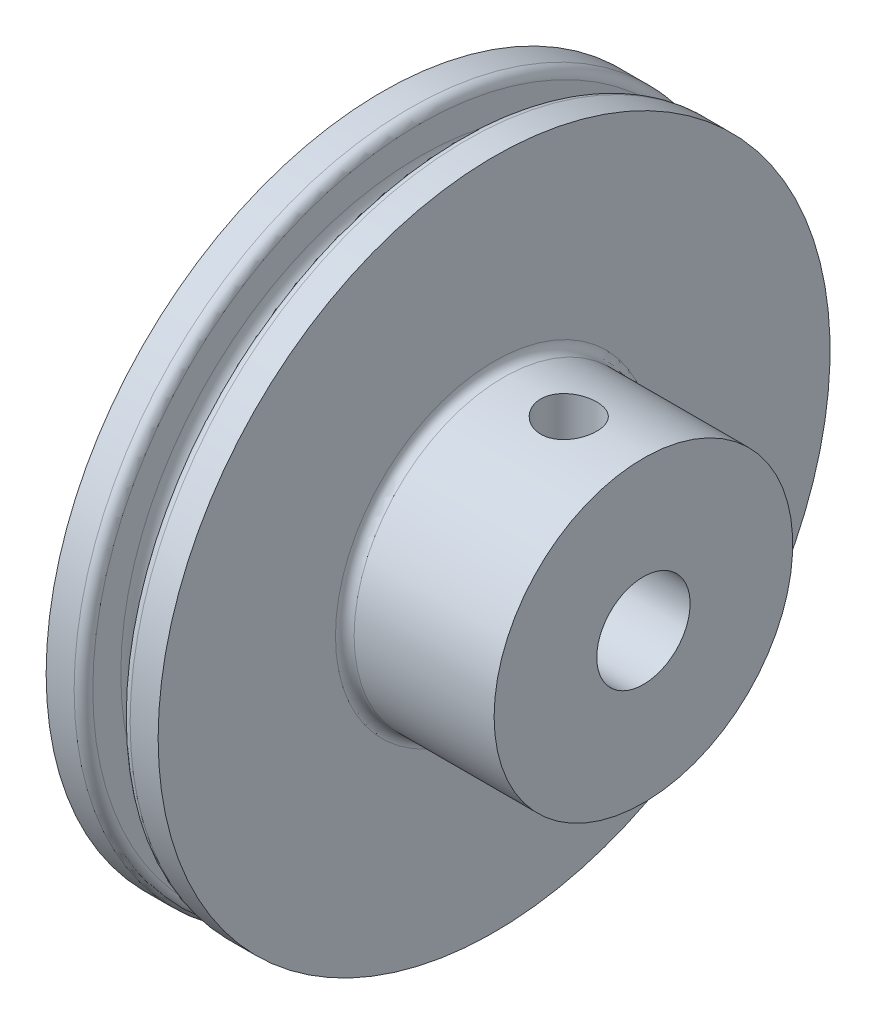
ISO-10303-21;
HEADER;
FILE_DESCRIPTION(('STEP AP214'),'2;1');
FILE_NAME('part.step','',(''),(''),'','','');
FILE_SCHEMA(('AUTOMOTIVE_DESIGN { 1 0 10303 214 1 1 1 1 }'));
ENDSEC;
DATA;
#1=APPLICATION_CONTEXT('core data for automotive mechanical design processes');
#2=APPLICATION_PROTOCOL_DEFINITION('international standard','automotive_design',2000,#1);
#3=PRODUCT_CONTEXT('',#1,'mechanical');
#4=PRODUCT('Part','Part','',(#3));
#5=PRODUCT_RELATED_PRODUCT_CATEGORY('part','',(#4));
#6=PRODUCT_DEFINITION_FORMATION('','',#4);
#7=PRODUCT_DEFINITION_CONTEXT('part definition',#1,'design');
#8=PRODUCT_DEFINITION('design','',#6,#7);
#9=PRODUCT_DEFINITION_SHAPE('','',#8);
#10=(LENGTH_UNIT() NAMED_UNIT(*) SI_UNIT(.MILLI.,.METRE.));
#11=(NAMED_UNIT(*) PLANE_ANGLE_UNIT() SI_UNIT($,.RADIAN.));
#12=(NAMED_UNIT(*) SI_UNIT($,.STERADIAN.) SOLID_ANGLE_UNIT());
#13=UNCERTAINTY_MEASURE_WITH_UNIT(LENGTH_MEASURE(1.E-05),#10,'distance_accuracy_value','');
#14=(GEOMETRIC_REPRESENTATION_CONTEXT(3) GLOBAL_UNCERTAINTY_ASSIGNED_CONTEXT((#13)) GLOBAL_UNIT_ASSIGNED_CONTEXT((#10,
#11,#12)) REPRESENTATION_CONTEXT('',''));
#15=CARTESIAN_POINT('',(0.,0.,0.));
#16=DIRECTION('',(0.,0.,1.));
#17=DIRECTION('',(1.,0.,0.));
#18=AXIS2_PLACEMENT_3D('',#15,#16,#17);
#19=CARTESIAN_POINT('',(-11.5426807899439,-7.97709760738326,0.));
#20=DIRECTION('',(-1.,0.,0.));
#21=DIRECTION('',(0.,0.,1.));
#22=AXIS2_PLACEMENT_3D('',#19,#20,#21);
#23=CYLINDRICAL_SURFACE('',#22,8.);
#24=CARTESIAN_POINT('',(2.45731921005608,-7.97709760738326,0.));
#25=DIRECTION('',(-1.,0.,0.));
#26=DIRECTION('',(0.,0.,1.));
#27=AXIS2_PLACEMENT_3D('',#24,#25,#26);
#28=CIRCLE('',#27,8.);
#29=CARTESIAN_POINT('',(2.45731921005608,-7.97709760738326,8.));
#30=VERTEX_POINT('',#29);
#31=EDGE_CURVE('E72',#30,#30,#28,.T.);
#32=ORIENTED_EDGE('',*,*,#31,.T.);
#33=EDGE_LOOP('',(#32));
#34=FACE_BOUND('',#33,.T.);
#35=CARTESIAN_POINT('',(-5.04268078994391,-7.97709760738326,0.));
#36=DIRECTION('',(-1.,0.,0.));
#37=DIRECTION('',(0.,0.,1.));
#38=AXIS2_PLACEMENT_3D('',#35,#36,#37);
#39=CIRCLE('',#38,8.);
#40=CARTESIAN_POINT('',(-5.04268078994391,-7.97709760738326,8.));
#41=VERTEX_POINT('',#40);
#42=EDGE_CURVE('E69',#41,#41,#39,.T.);
#43=ORIENTED_EDGE('',*,*,#42,.F.);
#44=EDGE_LOOP('',(#43));
#45=FACE_BOUND('',#44,.T.);
#46=CARTESIAN_POINT('',(-1.54268078994392,-0.1189807846324,-1.5));
#47=CARTESIAN_POINT('',(-1.62613799795566,-0.118979169448321,-1.49999679883246));
#48=CARTESIAN_POINT('',(-1.70963673816231,-0.117636809780593,-1.49301126348936));
#49=CARTESIAN_POINT('',(-1.87427975152583,-0.112419097239615,-1.46527253251805));
#50=CARTESIAN_POINT('',(-1.9554219663714,-0.108541595651204,-1.44450765768477));
#51=CARTESIAN_POINT('',(-2.11294586131479,-0.0987078427344111,-1.38987035617788));
#52=CARTESIAN_POINT('',(-2.18933189925121,-0.0927535283232876,-1.35601013954374));
#53=CARTESIAN_POINT('',(-2.33533434923073,-0.0794393441736656,-1.27617565760366));
#54=CARTESIAN_POINT('',(-2.40495128894722,-0.0720795841270393,-1.23020233759193));
#55=CARTESIAN_POINT('',(-2.53631098914305,-0.0566814589938103,-1.12683678942622));
#56=CARTESIAN_POINT('',(-2.59795727341565,-0.0486364411264648,-1.06932292933092));
#57=CARTESIAN_POINT('',(-2.71078517954348,-0.0328330307429168,-0.944771778803551));
#58=CARTESIAN_POINT('',(-2.76196611436871,-0.025074657071728,-0.877733863624944));
#59=CARTESIAN_POINT('',(-2.85278016654443,-0.010647429099206,-0.735403894570162));
#60=CARTESIAN_POINT('',(-2.89232232346334,-0.0039873268596266,-0.660052840033865));
#61=CARTESIAN_POINT('',(-2.95815033221745,0.0074184789460498,-0.503631283250762));
#62=CARTESIAN_POINT('',(-2.98443727393414,0.012164339900085,-0.422561251859505));
#63=CARTESIAN_POINT('',(-3.02271033855505,0.0191599438545286,-0.258002746187416));
#64=CARTESIAN_POINT('',(-3.0348590958666,0.0214380523800125,-0.174553323244857));
#65=CARTESIAN_POINT('',(-3.04501767764432,0.0233392387726849,-0.00677167603538295));
#66=CARTESIAN_POINT('',(-3.04302870608297,0.0229625427237117,0.0775604724476703));
#67=CARTESIAN_POINT('',(-3.02509301879677,0.019618730249157,0.243598357899397));
#68=CARTESIAN_POINT('',(-3.00932142051391,0.0166841150888811,0.325323760451469));
#69=CARTESIAN_POINT('',(-2.96454514054868,0.0085906559523551,0.484947165715476));
#70=CARTESIAN_POINT('',(-2.93553997659811,0.00343173091639956,0.562845028826541));
#71=CARTESIAN_POINT('',(-2.86495305888562,-0.00858500440986463,0.713110065751521));
#72=CARTESIAN_POINT('',(-2.82330130203142,-0.0154522314750013,0.785443571838533));
#73=CARTESIAN_POINT('',(-2.72865512086676,-0.030126131954757,0.922159977214638));
#74=CARTESIAN_POINT('',(-2.67565954305634,-0.0379329008716158,0.986542066910785));
#75=CARTESIAN_POINT('',(-2.55886508696039,-0.0537624705775899,1.10656561896904));
#76=CARTESIAN_POINT('',(-2.49491300604184,-0.0617867483670413,1.16205790757041));
#77=CARTESIAN_POINT('',(-2.35853125866529,-0.07703251813705,1.2615517185126));
#78=CARTESIAN_POINT('',(-2.28610146817928,-0.0842539983697489,1.30555307271182));
#79=CARTESIAN_POINT('',(-2.13462251924126,-0.0970786743120412,1.38085852224478));
#80=CARTESIAN_POINT('',(-2.05556233275327,-0.102679102080645,1.41214093645421));
#81=CARTESIAN_POINT('',(-1.89317960582072,-0.111585183416364,1.46093656975056));
#82=CARTESIAN_POINT('',(-1.80985754947913,-0.114891096997061,1.47845134901108));
#83=CARTESIAN_POINT('',(-1.64266146108804,-0.118782404373203,1.49899672649739));
#84=CARTESIAN_POINT('',(-1.5588146743784,-0.119408049221891,1.50224164285859));
#85=CARTESIAN_POINT('',(-1.39177733485677,-0.117975693174853,1.49472968881724));
#86=CARTESIAN_POINT('',(-1.30858674979583,-0.115917824997143,1.48397351086433));
#87=CARTESIAN_POINT('',(-1.14592788688953,-0.109387806751202,1.44894868195883));
#88=CARTESIAN_POINT('',(-1.06643453731902,-0.104935740474469,1.4247923858399));
#89=CARTESIAN_POINT('',(-0.91262360021376,-0.0941362658170685,1.3637722437906));
#90=CARTESIAN_POINT('',(-0.838306394628586,-0.0877887177504444,1.32690746128795));
#91=CARTESIAN_POINT('',(-0.696013170900749,-0.0738218287464044,1.2410235311966));
#92=CARTESIAN_POINT('',(-0.628120252077844,-0.0661886531301031,1.19186899639621));
#93=CARTESIAN_POINT('',(-0.501468749729585,-0.0505494937022523,1.08298344344247));
#94=CARTESIAN_POINT('',(-0.442710988388144,-0.0425434764183196,1.02325147433084));
#95=CARTESIAN_POINT('',(-0.335197026409792,-0.0269313673237975,0.893949417870385));
#96=CARTESIAN_POINT('',(-0.286584963337952,-0.0193320490502059,0.82425853409589));
#97=CARTESIAN_POINT('',(-0.201759583766254,-0.0055035592797496,0.677574523040139));
#98=CARTESIAN_POINT('',(-0.165545789918912,0.000725664963992805,0.600581677038528));
#99=CARTESIAN_POINT('',(-0.106760692079837,0.0110829725752218,0.441877541578683));
#100=CARTESIAN_POINT('',(-0.0841186023825082,0.0152219399181671,0.360193213078987));
#101=CARTESIAN_POINT('',(-0.052893741654032,0.020978813454195,0.19409622738157));
#102=CARTESIAN_POINT('',(-0.0443094912812086,0.0225969849160743,0.10968385821585));
#103=CARTESIAN_POINT('',(-0.0414954884254764,0.0231246677711521,-0.05809076025051));
#104=CARTESIAN_POINT('',(-0.0470480368143909,0.022075258867063,-0.141449307066269));
#105=CARTESIAN_POINT('',(-0.0718732177123534,0.0174710587337709,-0.3060233692792));
#106=CARTESIAN_POINT('',(-0.0911457186881286,0.0139162915234572,-0.38723890521369));
#107=CARTESIAN_POINT('',(-0.142771997327635,0.00470077239719345,-0.545106475595485));
#108=CARTESIAN_POINT('',(-0.175102602824925,-0.00095624756749898,-0.621766319318224));
#109=CARTESIAN_POINT('',(-0.251901243599101,-0.0137638866955471,-0.768605631316695));
#110=CARTESIAN_POINT('',(-0.296370092050572,-0.0209146059184257,-0.838784665003271));
#111=CARTESIAN_POINT('',(-0.39693224438624,-0.0360498087838449,-0.971755027780007));
#112=CARTESIAN_POINT('',(-0.453182823805624,-0.044044761470537,-1.03442623539053));
#113=CARTESIAN_POINT('',(-0.575385352436625,-0.0599012719949244,-1.14951536065485));
#114=CARTESIAN_POINT('',(-0.641339580317638,-0.0677627980156094,-1.2019308632478));
#115=CARTESIAN_POINT('',(-0.781807244647263,-0.0825418331239993,-1.29547633945385));
#116=CARTESIAN_POINT('',(-0.856394229611557,-0.0894499345759686,-1.33649740531872));
#117=CARTESIAN_POINT('',(-1.01150657992366,-0.101426760882926,-1.40536132423417));
#118=CARTESIAN_POINT('',(-1.0920262565333,-0.106497220892092,-1.43321661638912));
#119=CARTESIAN_POINT('',(-1.23443307800983,-0.113167444462008,-1.46929726596175));
#120=CARTESIAN_POINT('',(-1.29548651370586,-0.115334500203935,-1.4807910573985));
#121=CARTESIAN_POINT('',(-1.41857925836423,-0.118241751428211,-1.49614351076215));
#122=CARTESIAN_POINT('',(-1.48061854044424,-0.118981985750431,-1.50000238052127));
#123=CARTESIAN_POINT('',(-1.54268078994392,-0.1189807846324,-1.5));
#124=B_SPLINE_CURVE_WITH_KNOTS('',3,(#46,#47,#48,#49,#50,#51,#52,#53,#54,#55,#56,#57,#58,#59,
#60,#61,#62,#63,#64,#65,#66,#67,#68,#69,#70,#71,#72,#73,#74,#75,#76,#77,#78,#79,#80,#81,#82,#83,
#84,#85,#86,#87,#88,#89,#90,#91,#92,#93,#94,#95,#96,#97,#98,#99,#100,#101,#102,#103,#104,#105,
#106,#107,#108,#109,#110,#111,#112,#113,#114,#115,#116,#117,#118,#119,#120,#121,#122,#123),
.UNSPECIFIED.,.T.,.F.,(4,2,2,2,2,2,2,2,2,2,2,2,2,2,2,2,2,2,2,2,2,2,2,2,2,2,2,2,2,2,2,2,2,2,2,2,
2,2,4),(0.,0.250144505793186,0.500501302380393,0.750625227978432,1.00072963993908,
1.25362335698691,1.50653367069315,1.76137104348047,2.0161874593964,2.26804275460261,
2.51987660200648,2.76855650598725,3.01724547328425,3.26733691984219,3.51745380911785,
3.77140614764064,4.025362201924,4.27974936118266,4.53410768866488,4.78463248587075,
5.03514489338718,5.28358792315368,5.53204926624317,5.78337862654143,6.03473059394677,
6.28944125495871,6.54414210821705,6.79750269418683,7.0508366166733,7.30029300570138,
7.54974700322167,7.79876026530358,8.0477902135711,8.30038464008745,8.55303847730765,
8.80803001818118,9.06278015749119,9.24880307527214,9.43482092920425),.UNSPECIFIED.);
#125=CARTESIAN_POINT('',(-1.54268078994392,-0.1189807846324,-1.5));
#126=VERTEX_POINT('',#125);
#127=EDGE_CURVE('E81',#126,#126,#124,.T.);
#128=ORIENTED_EDGE('',*,*,#127,.F.);
#129=EDGE_LOOP('',(#128));
#130=FACE_BOUND('',#129,.T.);
#131=ADVANCED_FACE('F30',(#34,#45,#130),#23,.T.);
#132=CARTESIAN_POINT('',(-11.5426807899439,-7.97709760738326,0.));
#133=DIRECTION('',(-1.,0.,0.));
#134=DIRECTION('',(0.,0.,1.));
#135=AXIS2_PLACEMENT_3D('',#132,#133,#134);
#136=CYLINDRICAL_SURFACE('',#135,2.5);
#137=CARTESIAN_POINT('',(-11.5426807899439,-7.97709760738326,0.));
#138=DIRECTION('',(-1.,0.,0.));
#139=DIRECTION('',(0.,0.,1.));
#140=AXIS2_PLACEMENT_3D('',#137,#138,#139);
#141=CIRCLE('',#140,2.5);
#142=CARTESIAN_POINT('',(-11.5426807899439,-7.97709760738326,2.5));
#143=VERTEX_POINT('',#142);
#144=EDGE_CURVE('E78',#143,#143,#141,.T.);
#145=ORIENTED_EDGE('',*,*,#144,.T.);
#146=EDGE_LOOP('',(#145));
#147=FACE_BOUND('',#146,.T.);
#148=CARTESIAN_POINT('',(2.45731921005608,-7.97709760738326,0.));
#149=DIRECTION('',(-1.,0.,0.));
#150=DIRECTION('',(0.,0.,1.));
#151=AXIS2_PLACEMENT_3D('',#148,#149,#150);
#152=CIRCLE('',#151,2.5);
#153=CARTESIAN_POINT('',(2.45731921005608,-7.97709760738326,2.5));
#154=VERTEX_POINT('',#153);
#155=EDGE_CURVE('E75',#154,#154,#152,.T.);
#156=ORIENTED_EDGE('',*,*,#155,.F.);
#157=EDGE_LOOP('',(#156));
#158=FACE_BOUND('',#157,.T.);
#159=CARTESIAN_POINT('',(-1.54268078994392,-5.97709760738325,-1.5));
#160=CARTESIAN_POINT('',(-1.46720181465428,-5.97710344095814,-1.50000404108592));
#161=CARTESIAN_POINT('',(-1.39174235586412,-5.97276126834844,-1.49426852824013));
#162=CARTESIAN_POINT('',(-1.2433568859817,-5.95617170124443,-1.47174965152787));
#163=CARTESIAN_POINT('',(-1.17043360255882,-5.94391605695228,-1.45495475788936));
#164=CARTESIAN_POINT('',(-1.02959714826664,-5.91347421703596,-1.41143486335795));
#165=CARTESIAN_POINT('',(-0.961651951908651,-5.89533094555206,-1.3847815450315));
#166=CARTESIAN_POINT('',(-0.831243336575999,-5.8552385574249,-1.32252909283019));
#167=CARTESIAN_POINT('',(-0.76878156024878,-5.8332883061591,-1.28692729054693));
#168=CARTESIAN_POINT('',(-0.642731773279836,-5.78481166150783,-1.20271292747644));
#169=CARTESIAN_POINT('',(-0.579939832819976,-5.75805389700663,-1.15304179435289));
#170=CARTESIAN_POINT('',(-0.462916027202164,-5.70483531307265,-1.04426801309985));
#171=CARTESIAN_POINT('',(-0.408690638273116,-5.67837473221223,-0.985158296729613));
#172=CARTESIAN_POINT('',(-0.304546980234223,-5.62534192879592,-0.851442367411701));
#173=CARTESIAN_POINT('',(-0.255726326274167,-5.59906627160508,-0.775851995162548));
#174=CARTESIAN_POINT('',(-0.171871067499486,-5.55265973755146,-0.615654228271658));
#175=CARTESIAN_POINT('',(-0.136823815821204,-5.53252322749591,-0.531055196626331));
#176=CARTESIAN_POINT('',(-0.0850848671312704,-5.50238772937885,-0.363771406742667));
#177=CARTESIAN_POINT('',(-0.0669604289766213,-5.49160456799156,-0.281674698130916));
#178=CARTESIAN_POINT('',(-0.0447379870807973,-5.4783482146078,-0.114970509382709));
#179=CARTESIAN_POINT('',(-0.0406268119438634,-5.47586721925018,-0.0303654624001541));
#180=CARTESIAN_POINT('',(-0.0462945372863787,-5.47926388026787,0.127637283737309));
#181=CARTESIAN_POINT('',(-0.0544143161132306,-5.48414323224599,0.201123832865634));
#182=CARTESIAN_POINT('',(-0.0811605855920249,-5.50001763184468,0.345464269151767));
#183=CARTESIAN_POINT('',(-0.0997878538510733,-5.51101313209017,0.416317961051201));
#184=CARTESIAN_POINT('',(-0.146846352647696,-5.53824853536606,0.554056780469079));
#185=CARTESIAN_POINT('',(-0.175333851082915,-5.55451850287502,0.620916491037617));
#186=CARTESIAN_POINT('',(-0.24106540616946,-5.59100123099577,0.74898866011561));
#187=CARTESIAN_POINT('',(-0.278311737002929,-5.61121501536514,0.810199646208011));
#188=CARTESIAN_POINT('',(-0.365519882748369,-5.65671834761963,0.933074267143199));
#189=CARTESIAN_POINT('',(-0.416469101679654,-5.68232577786176,0.993918663198193));
#190=CARTESIAN_POINT('',(-0.527084907804094,-5.73454206492724,1.10671465909275));
#191=CARTESIAN_POINT('',(-0.586763293418424,-5.7611522403495,1.1586540130834));
#192=CARTESIAN_POINT('',(-0.721334196107472,-5.8159868561438,1.25824837767417));
#193=CARTESIAN_POINT('',(-0.79718836648338,-5.84404099353201,1.30470933188632));
#194=CARTESIAN_POINT('',(-0.957387021580526,-5.89458881181058,1.38397217194232));
#195=CARTESIAN_POINT('',(-1.04171550606956,-5.91709270439505,1.41679921962189));
#196=CARTESIAN_POINT('',(-1.19507442183927,-5.94813895541594,1.46077497064842));
#197=CARTESIAN_POINT('',(-1.26272142224056,-5.9587587212001,1.47527903312665));
#198=CARTESIAN_POINT('',(-1.4000544002434,-5.97317609960767,1.49480872755284));
#199=CARTESIAN_POINT('',(-1.46973791042848,-5.97698164623209,1.49984538302907));
#200=CARTESIAN_POINT('',(-1.60923247237962,-5.97720846417003,1.50014781114183));
#201=CARTESIAN_POINT('',(-1.67904356715913,-5.97361950514341,1.49540004697659));
#202=CARTESIAN_POINT('',(-1.81666813369248,-5.95958239949673,1.47640290574941));
#203=CARTESIAN_POINT('',(-1.88447998218417,-5.94912883125113,1.46214601830139));
#204=CARTESIAN_POINT('',(-2.0163953694237,-5.92277992405225,1.42488312618657));
#205=CARTESIAN_POINT('',(-2.08050342647615,-5.90689138645514,1.40188805257362));
#206=CARTESIAN_POINT('',(-2.2041585056741,-5.87138221320739,1.34796261057072));
#207=CARTESIAN_POINT('',(-2.26370379630992,-5.85176017048327,1.31702924888212));
#208=CARTESIAN_POINT('',(-2.38792087245616,-5.80672941560589,1.24167439558512));
#209=CARTESIAN_POINT('',(-2.45158162504049,-5.78091521340957,1.19582663060303));
#210=CARTESIAN_POINT('',(-2.57096627479338,-5.72888005934705,1.09487395518701));
#211=CARTESIAN_POINT('',(-2.62668248211303,-5.70265874026871,1.03976018672402));
#212=CARTESIAN_POINT('',(-2.73590479729435,-5.64874134827412,0.913274837212767));
#213=CARTESIAN_POINT('',(-2.78818151654975,-5.62129684862456,0.840721108780192));
#214=CARTESIAN_POINT('',(-2.87958356678057,-5.57172121604867,0.686103100868021));
#215=CARTESIAN_POINT('',(-2.91871761778484,-5.54958656288915,0.604045176134704));
#216=CARTESIAN_POINT('',(-2.97954899337528,-5.51457480645551,0.438840232972139));
#217=CARTESIAN_POINT('',(-3.00230701773502,-5.50114172670997,0.356205963651259));
#218=CARTESIAN_POINT('',(-3.03339539279018,-5.48269021832226,0.187383063890858));
#219=CARTESIAN_POINT('',(-3.04174208066154,-5.47766226155588,0.10119857178197));
#220=CARTESIAN_POINT('',(-3.04335539852984,-5.4766916027635,-0.0598120232009827));
#221=CARTESIAN_POINT('',(-3.03848412450695,-5.47962703551999,-0.134620583589705));
#222=CARTESIAN_POINT('',(-3.0177869655623,-5.4919681232623,-0.282148755978772));
#223=CARTESIAN_POINT('',(-3.00196095862232,-5.50137385031686,-0.354868344701913));
#224=CARTESIAN_POINT('',(-2.96046121836013,-5.52560333211364,-0.495145481978796));
#225=CARTESIAN_POINT('',(-2.93494919381467,-5.54033793879419,-0.562767032608829));
#226=CARTESIAN_POINT('',(-2.87504019538917,-5.57406423291171,-0.692781971999983));
#227=CARTESIAN_POINT('',(-2.84064122908432,-5.59305687486058,-0.755174184199831));
#228=CARTESIAN_POINT('',(-2.75975559337516,-5.63616328078945,-0.880263645295946));
#229=CARTESIAN_POINT('',(-2.71236208092705,-5.66060916099176,-0.942258690439938));
#230=CARTESIAN_POINT('',(-2.60892775622619,-5.71107853387664,-1.05789751536306));
#231=CARTESIAN_POINT('',(-2.55287736433601,-5.73710375463817,-1.11153190956916));
#232=CARTESIAN_POINT('',(-2.42539522776622,-5.79181595072121,-1.2159097535057));
#233=CARTESIAN_POINT('',(-2.35291430377842,-5.82042194467425,-1.26542406663367));
#234=CARTESIAN_POINT('',(-2.19919593717738,-5.8733329625318,-1.35156817210325));
#235=CARTESIAN_POINT('',(-2.1179630759625,-5.89764021927273,-1.38820466322661));
#236=CARTESIAN_POINT('',(-1.95561650480672,-5.93629757690365,-1.44437116535132));
#237=CARTESIAN_POINT('',(-1.87508555398267,-5.95132094908187,-1.46509526060187));
#238=CARTESIAN_POINT('',(-1.71058339524024,-5.97170728418289,-1.49289268240426));
#239=CARTESIAN_POINT('',(-1.62662002418521,-5.97709111993682,-1.49999550595837));
#240=CARTESIAN_POINT('',(-1.54268078994392,-5.97709760738325,-1.5));
#241=B_SPLINE_CURVE_WITH_KNOTS('',3,(#159,#160,#161,#162,#163,#164,#165,#166,#167,#168,#169,
#170,#171,#172,#173,#174,#175,#176,#177,#178,#179,#180,#181,#182,#183,#184,#185,#186,#187,#188,
#189,#190,#191,#192,#193,#194,#195,#196,#197,#198,#199,#200,#201,#202,#203,#204,#205,#206,#207,
#208,#209,#210,#211,#212,#213,#214,#215,#216,#217,#218,#219,#220,#221,#222,#223,#224,#225,#226,
#227,#228,#229,#230,#231,#232,#233,#234,#235,#236,#237,#238,#239,#240),.UNSPECIFIED.,.T.,.F.,(4,
2,2,2,2,2,2,2,2,2,2,2,2,2,2,2,2,2,2,2,2,2,2,2,2,2,2,2,2,2,2,2,2,2,2,2,2,2,2,2,4),(0.,
0.226085249493392,0.45240657433077,0.677113624991876,0.901887762215932,1.15414462390001,
1.40659128601844,1.68630157736223,1.9657544327122,2.21853330858497,2.47107452602766,
2.69230130543181,2.91354445887944,3.13607155036376,3.35865648368878,3.60782810055849,
3.85733966656908,4.13576671140276,4.41367760154768,4.62276298054684,4.83160475643976,
5.04073566011181,5.25003193304127,5.45906724365495,5.6681814915466,5.91499438482002,
6.16204457978454,6.44121828011588,6.72020638384847,6.97891479383337,7.23732973022726,
7.46129321849399,7.68525920139647,7.90563970188756,8.12606965394584,8.37042963549486,
8.61506198741954,8.89071695766603,9.16622832484805,9.41820120134353,9.66962780912277),.UNSPECIFIED.);
#242=CARTESIAN_POINT('',(-1.54268078994392,-5.97709760738325,-1.5));
#243=VERTEX_POINT('',#242);
#244=EDGE_CURVE('E34',#243,#243,#241,.T.);
#245=ORIENTED_EDGE('',*,*,#244,.F.);
#246=EDGE_LOOP('',(#245));
#247=FACE_BOUND('',#246,.T.);
#248=ADVANCED_FACE('F94',(#147,#158,#247),#136,.F.);
#249=CARTESIAN_POINT('',(-11.5426807899439,10.0229023926167,0.));
#250=DIRECTION('',(1.,0.,0.));
#251=DIRECTION('',(0.,0.,-1.));
#252=AXIS2_PLACEMENT_3D('',#249,#250,#251);
#253=PLANE('',#252);
#254=ORIENTED_EDGE('',*,*,#144,.F.);
#255=EDGE_LOOP('',(#254));
#256=FACE_BOUND('',#255,.T.);
#257=CARTESIAN_POINT('',(-11.5426807899439,-7.97709760738326,0.));
#258=DIRECTION('',(-1.,0.,0.));
#259=DIRECTION('',(0.,0.,1.));
#260=AXIS2_PLACEMENT_3D('',#257,#258,#259);
#261=CIRCLE('',#260,18.);
#262=CARTESIAN_POINT('',(-11.5426807899439,-7.97709760738326,18.));
#263=VERTEX_POINT('',#262);
#264=EDGE_CURVE('E10',#263,#263,#261,.T.);
#265=ORIENTED_EDGE('',*,*,#264,.T.);
#266=EDGE_LOOP('',(#265));
#267=FACE_BOUND('',#266,.T.);
#268=ADVANCED_FACE('F32',(#256,#267),#253,.F.);
#269=CARTESIAN_POINT('',(-11.5426807899439,-7.97709760738326,0.));
#270=DIRECTION('',(-1.,0.,0.));
#271=DIRECTION('',(0.,0.,1.));
#272=AXIS2_PLACEMENT_3D('',#269,#270,#271);
#273=CYLINDRICAL_SURFACE('',#272,18.);
#274=ORIENTED_EDGE('',*,*,#264,.F.);
#275=EDGE_LOOP('',(#274));
#276=FACE_BOUND('',#275,.T.);
#277=CARTESIAN_POINT('',(-10.0426807899439,-7.97709760738326,0.));
#278=DIRECTION('',(-1.,0.,0.));
#279=DIRECTION('',(0.,0.,1.));
#280=AXIS2_PLACEMENT_3D('',#277,#278,#279);
#281=CIRCLE('',#280,18.);
#282=CARTESIAN_POINT('',(-10.0426807899439,-7.97709760738326,18.));
#283=VERTEX_POINT('',#282);
#284=EDGE_CURVE('E42',#283,#283,#281,.T.);
#285=ORIENTED_EDGE('',*,*,#284,.T.);
#286=EDGE_LOOP('',(#285));
#287=FACE_BOUND('',#286,.T.);
#288=ADVANCED_FACE('F130',(#276,#287),#273,.T.);
#289=CARTESIAN_POINT('',(-10.0426807899439,-7.97709760738326,0.));
#290=DIRECTION('',(-1.,0.,0.));
#291=DIRECTION('',(0.,0.,1.));
#292=AXIS2_PLACEMENT_3D('',#289,#290,#291);
#293=TOROIDAL_SURFACE('',#292,17.5,0.5);
#294=ORIENTED_EDGE('',*,*,#284,.F.);
#295=EDGE_LOOP('',(#294));
#296=FACE_BOUND('',#295,.T.);
#297=CARTESIAN_POINT('',(-9.54268078994391,-7.97709760738326,0.));
#298=DIRECTION('',(-1.,0.,0.));
#299=DIRECTION('',(0.,0.,1.));
#300=AXIS2_PLACEMENT_3D('',#297,#298,#299);
#301=CIRCLE('',#300,17.5);
#302=CARTESIAN_POINT('',(-9.54268078994391,-7.97709760738326,17.5));
#303=VERTEX_POINT('',#302);
#304=EDGE_CURVE('E46',#303,#303,#301,.T.);
#305=ORIENTED_EDGE('',*,*,#304,.T.);
#306=EDGE_LOOP('',(#305));
#307=FACE_BOUND('',#306,.T.);
#308=ADVANCED_FACE('F137',(#296,#307),#293,.T.);
#309=CARTESIAN_POINT('',(-9.54268078994391,9.52290239261674,0.));
#310=DIRECTION('',(-1.,0.,0.));
#311=DIRECTION('',(0.,0.,1.));
#312=AXIS2_PLACEMENT_3D('',#309,#310,#311);
#313=PLANE('',#312);
#314=ORIENTED_EDGE('',*,*,#304,.F.);
#315=EDGE_LOOP('',(#314));
#316=FACE_BOUND('',#315,.T.);
#317=CARTESIAN_POINT('',(-9.54268078994392,-7.97709760738326,0.));
#318=DIRECTION('',(-1.,0.,0.));
#319=DIRECTION('',(0.,0.,1.));
#320=AXIS2_PLACEMENT_3D('',#317,#318,#319);
#321=CIRCLE('',#320,16.0000000599991);
#322=CARTESIAN_POINT('',(-9.54268078994392,-7.97709760738326,16.0000000599991));
#323=VERTEX_POINT('',#322);
#324=EDGE_CURVE('E51',#323,#323,#321,.T.);
#325=ORIENTED_EDGE('',*,*,#324,.T.);
#326=EDGE_LOOP('',(#325));
#327=FACE_BOUND('',#326,.T.);
#328=ADVANCED_FACE('F144',(#316,#327),#313,.F.);
#329=CARTESIAN_POINT('',(-8.54268078994391,-7.97709760738325,0.));
#330=DIRECTION('',(-1.,0.,0.));
#331=DIRECTION('',(0.,0.,1.));
#332=AXIS2_PLACEMENT_3D('',#329,#330,#331);
#333=TOROIDAL_SURFACE('',#332,16.0000000599991,1.);
#334=ORIENTED_EDGE('',*,*,#324,.F.);
#335=EDGE_LOOP('',(#334));
#336=FACE_BOUND('',#335,.T.);
#337=CARTESIAN_POINT('',(-7.54268078994391,-7.97709760738326,0.));
#338=DIRECTION('',(-1.,0.,0.));
#339=DIRECTION('',(0.,0.,1.));
#340=AXIS2_PLACEMENT_3D('',#337,#338,#339);
#341=CIRCLE('',#340,16.0000000599991);
#342=CARTESIAN_POINT('',(-7.54268078994391,-7.97709760738326,16.0000000599991));
#343=VERTEX_POINT('',#342);
#344=EDGE_CURVE('E54',#343,#343,#341,.T.);
#345=ORIENTED_EDGE('',*,*,#344,.T.);
#346=EDGE_LOOP('',(#345));
#347=FACE_BOUND('',#346,.T.);
#348=ADVANCED_FACE('F152',(#336,#347),#333,.F.);
#349=CARTESIAN_POINT('',(-7.54268078994391,9.52290239261674,0.));
#350=DIRECTION('',(1.,0.,0.));
#351=DIRECTION('',(0.,0.,-1.));
#352=AXIS2_PLACEMENT_3D('',#349,#350,#351);
#353=PLANE('',#352);
#354=ORIENTED_EDGE('',*,*,#344,.F.);
#355=EDGE_LOOP('',(#354));
#356=FACE_BOUND('',#355,.T.);
#357=CARTESIAN_POINT('',(-7.54268078994391,-7.97709760738326,0.));
#358=DIRECTION('',(-1.,0.,0.));
#359=DIRECTION('',(0.,0.,1.));
#360=AXIS2_PLACEMENT_3D('',#357,#358,#359);
#361=CIRCLE('',#360,17.5);
#362=CARTESIAN_POINT('',(-7.54268078994391,-7.97709760738326,17.5));
#363=VERTEX_POINT('',#362);
#364=EDGE_CURVE('E57',#363,#363,#361,.T.);
#365=ORIENTED_EDGE('',*,*,#364,.T.);
#366=EDGE_LOOP('',(#365));
#367=FACE_BOUND('',#366,.T.);
#368=ADVANCED_FACE('F160',(#356,#367),#353,.F.);
#369=CARTESIAN_POINT('',(-7.04268078994391,-7.97709760738326,0.));
#370=DIRECTION('',(-1.,0.,0.));
#371=DIRECTION('',(0.,0.,1.));
#372=AXIS2_PLACEMENT_3D('',#369,#370,#371);
#373=TOROIDAL_SURFACE('',#372,17.5,0.5);
#374=ORIENTED_EDGE('',*,*,#364,.F.);
#375=EDGE_LOOP('',(#374));
#376=FACE_BOUND('',#375,.T.);
#377=CARTESIAN_POINT('',(-7.04268078994391,-7.97709760738326,0.));
#378=DIRECTION('',(-1.,0.,0.));
#379=DIRECTION('',(0.,0.,1.));
#380=AXIS2_PLACEMENT_3D('',#377,#378,#379);
#381=CIRCLE('',#380,18.);
#382=CARTESIAN_POINT('',(-7.04268078994391,-7.97709760738326,18.));
#383=VERTEX_POINT('',#382);
#384=EDGE_CURVE('E60',#383,#383,#381,.T.);
#385=ORIENTED_EDGE('',*,*,#384,.T.);
#386=EDGE_LOOP('',(#385));
#387=FACE_BOUND('',#386,.T.);
#388=ADVANCED_FACE('F168',(#376,#387),#373,.T.);
#389=CARTESIAN_POINT('',(-11.5426807899439,-7.97709760738326,0.));
#390=DIRECTION('',(-1.,0.,0.));
#391=DIRECTION('',(0.,0.,1.));
#392=AXIS2_PLACEMENT_3D('',#389,#390,#391);
#393=CYLINDRICAL_SURFACE('',#392,18.);
#394=ORIENTED_EDGE('',*,*,#384,.F.);
#395=EDGE_LOOP('',(#394));
#396=FACE_BOUND('',#395,.T.);
#397=CARTESIAN_POINT('',(-5.54268078994392,-7.97709760738326,0.));
#398=DIRECTION('',(-1.,0.,0.));
#399=DIRECTION('',(0.,0.,1.));
#400=AXIS2_PLACEMENT_3D('',#397,#398,#399);
#401=CIRCLE('',#400,18.);
#402=CARTESIAN_POINT('',(-5.54268078994392,-7.97709760738326,18.));
#403=VERTEX_POINT('',#402);
#404=EDGE_CURVE('E63',#403,#403,#401,.T.);
#405=ORIENTED_EDGE('',*,*,#404,.T.);
#406=EDGE_LOOP('',(#405));
#407=FACE_BOUND('',#406,.T.);
#408=ADVANCED_FACE('F176',(#396,#407),#393,.T.);
#409=CARTESIAN_POINT('',(-5.54268078994392,10.0229023926167,0.));
#410=DIRECTION('',(-1.,0.,0.));
#411=DIRECTION('',(0.,0.,1.));
#412=AXIS2_PLACEMENT_3D('',#409,#410,#411);
#413=PLANE('',#412);
#414=ORIENTED_EDGE('',*,*,#404,.F.);
#415=EDGE_LOOP('',(#414));
#416=FACE_BOUND('',#415,.T.);
#417=CARTESIAN_POINT('',(-5.54268078994392,-7.97709760738326,0.));
#418=DIRECTION('',(-1.,0.,0.));
#419=DIRECTION('',(0.,0.,1.));
#420=AXIS2_PLACEMENT_3D('',#417,#418,#419);
#421=CIRCLE('',#420,8.5);
#422=CARTESIAN_POINT('',(-5.54268078994392,-7.97709760738326,8.5));
#423=VERTEX_POINT('',#422);
#424=EDGE_CURVE('E66',#423,#423,#421,.T.);
#425=ORIENTED_EDGE('',*,*,#424,.T.);
#426=EDGE_LOOP('',(#425));
#427=FACE_BOUND('',#426,.T.);
#428=ADVANCED_FACE('F105',(#416,#427),#413,.F.);
#429=CARTESIAN_POINT('',(-5.04268078994392,-7.97709760738326,0.));
#430=DIRECTION('',(-1.,0.,0.));
#431=DIRECTION('',(0.,0.,1.));
#432=AXIS2_PLACEMENT_3D('',#429,#430,#431);
#433=TOROIDAL_SURFACE('',#432,8.5,0.5);
#434=ORIENTED_EDGE('',*,*,#424,.F.);
#435=EDGE_LOOP('',(#434));
#436=FACE_BOUND('',#435,.T.);
#437=ORIENTED_EDGE('',*,*,#42,.T.);
#438=EDGE_LOOP('',(#437));
#439=FACE_BOUND('',#438,.T.);
#440=ADVANCED_FACE('F100',(#436,#439),#433,.F.);
#441=CARTESIAN_POINT('',(2.45731921005608,-5.47709760738326,0.));
#442=DIRECTION('',(-1.,0.,0.));
#443=DIRECTION('',(0.,0.,1.));
#444=AXIS2_PLACEMENT_3D('',#441,#442,#443);
#445=PLANE('',#444);
#446=ORIENTED_EDGE('',*,*,#31,.F.);
#447=EDGE_LOOP('',(#446));
#448=FACE_BOUND('',#447,.T.);
#449=ORIENTED_EDGE('',*,*,#155,.T.);
#450=EDGE_LOOP('',(#449));
#451=FACE_BOUND('',#450,.T.);
#452=ADVANCED_FACE('F92',(#448,#451),#445,.F.);
#453=CARTESIAN_POINT('',(-1.54268078994392,2.,0.));
#454=DIRECTION('',(0.,-1.,0.));
#455=DIRECTION('',(0.,0.,-1.));
#456=AXIS2_PLACEMENT_3D('',#453,#454,#455);
#457=CYLINDRICAL_SURFACE('',#456,1.5);
#458=ORIENTED_EDGE('',*,*,#244,.T.);
#459=EDGE_LOOP('',(#458));
#460=FACE_BOUND('',#459,.T.);
#461=ORIENTED_EDGE('',*,*,#127,.T.);
#462=EDGE_LOOP('',(#461));
#463=FACE_BOUND('',#462,.T.);
#464=ADVANCED_FACE('F89',(#460,#463),#457,.F.);
#465=CLOSED_SHELL('',(#131,#248,#268,#288,#308,#328,#348,#368,#388,#408,#428,#440,#452,#464));
#466=MANIFOLD_SOLID_BREP('B2',#465);
#467=ADVANCED_BREP_SHAPE_REPRESENTATION('',(#18,#466),#14);
#468=SHAPE_DEFINITION_REPRESENTATION(#9,#467);
ENDSEC;
END-ISO-10303-21;
